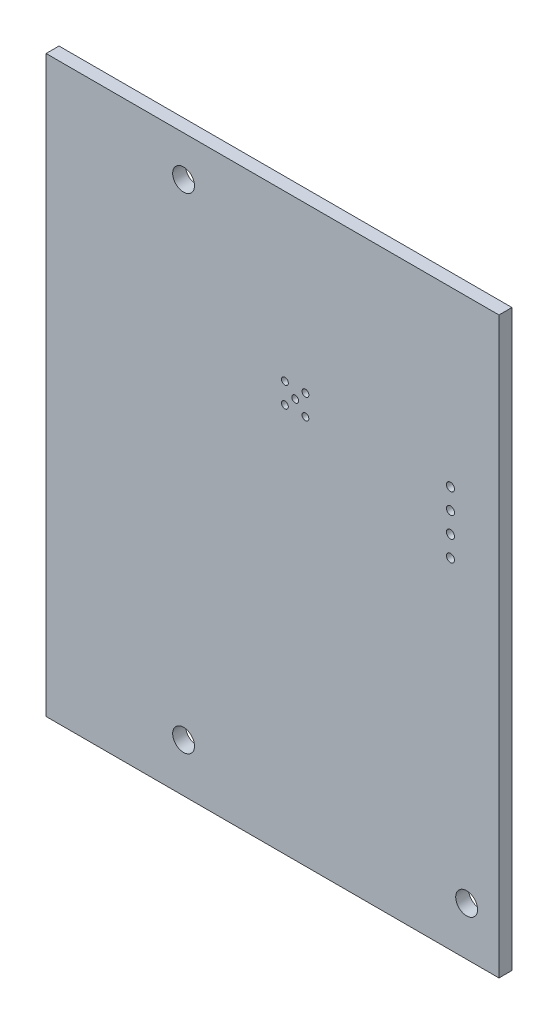
ISO-10303-21;
HEADER;
FILE_DESCRIPTION(('STEP AP214'),'2;1');
FILE_NAME('part.step','',(''),(''),'','','');
FILE_SCHEMA(('AUTOMOTIVE_DESIGN { 1 0 10303 214 1 1 1 1 }'));
ENDSEC;
DATA;
#1=APPLICATION_CONTEXT('core data for automotive mechanical design processes');
#2=APPLICATION_PROTOCOL_DEFINITION('international standard','automotive_design',2000,#1);
#3=PRODUCT_CONTEXT('',#1,'mechanical');
#4=PRODUCT('Part','Part','',(#3));
#5=PRODUCT_RELATED_PRODUCT_CATEGORY('part','',(#4));
#6=PRODUCT_DEFINITION_FORMATION('','',#4);
#7=PRODUCT_DEFINITION_CONTEXT('part definition',#1,'design');
#8=PRODUCT_DEFINITION('design','',#6,#7);
#9=PRODUCT_DEFINITION_SHAPE('','',#8);
#10=(LENGTH_UNIT() NAMED_UNIT(*) SI_UNIT(.MILLI.,.METRE.));
#11=(NAMED_UNIT(*) PLANE_ANGLE_UNIT() SI_UNIT($,.RADIAN.));
#12=(NAMED_UNIT(*) SI_UNIT($,.STERADIAN.) SOLID_ANGLE_UNIT());
#13=UNCERTAINTY_MEASURE_WITH_UNIT(LENGTH_MEASURE(1.E-05),#10,'distance_accuracy_value','');
#14=(GEOMETRIC_REPRESENTATION_CONTEXT(3) GLOBAL_UNCERTAINTY_ASSIGNED_CONTEXT((#13)) GLOBAL_UNIT_ASSIGNED_CONTEXT((#10,
#11,#12)) REPRESENTATION_CONTEXT('',''));
#15=CARTESIAN_POINT('',(0.,0.,0.));
#16=DIRECTION('',(0.,0.,1.));
#17=DIRECTION('',(1.,0.,0.));
#18=AXIS2_PLACEMENT_3D('',#15,#16,#17);
#19=CARTESIAN_POINT('',(105.,-65.,-0.8));
#20=DIRECTION('',(0.,0.,1.));
#21=DIRECTION('',(1.,0.,0.));
#22=AXIS2_PLACEMENT_3D('',#19,#20,#21);
#23=CYLINDRICAL_SURFACE('',#22,1.35);
#24=DIRECTION('',(0.,0.,1.));
#25=VECTOR('',#24,1.);
#26=CARTESIAN_POINT('',(106.35,-65.,-0.8));
#27=LINE('',#26,#25);
#28=CARTESIAN_POINT('',(106.35,-65.,0.));
#29=VERTEX_POINT('',#28);
#30=CARTESIAN_POINT('',(106.35,-65.,1.6));
#31=VERTEX_POINT('',#30);
#32=EDGE_CURVE('E11',#29,#31,#27,.T.);
#33=ORIENTED_EDGE('',*,*,#32,.F.);
#34=CARTESIAN_POINT('',(105.,-65.,0.));
#35=DIRECTION('',(0.,0.,1.));
#36=DIRECTION('',(1.,0.,0.));
#37=AXIS2_PLACEMENT_3D('',#34,#35,#36);
#38=CIRCLE('',#37,1.35);
#39=EDGE_CURVE('E173',#29,#29,#38,.T.);
#40=ORIENTED_EDGE('',*,*,#39,.F.);
#41=ORIENTED_EDGE('',*,*,#32,.T.);
#42=CARTESIAN_POINT('',(105.,-65.,1.6));
#43=DIRECTION('',(0.,0.,1.));
#44=DIRECTION('',(1.,0.,0.));
#45=AXIS2_PLACEMENT_3D('',#42,#43,#44);
#46=CIRCLE('',#45,1.35);
#47=EDGE_CURVE('E263',#31,#31,#46,.T.);
#48=ORIENTED_EDGE('',*,*,#47,.T.);
#49=EDGE_LOOP('',(#33,#40,#41,#48));
#50=FACE_BOUND('',#49,.T.);
#51=ADVANCED_FACE('F16',(#50),#23,.F.);
#52=CARTESIAN_POINT('',(117.53,-80.33,-0.8));
#53=DIRECTION('',(0.,0.,1.));
#54=DIRECTION('',(1.,0.,0.));
#55=AXIS2_PLACEMENT_3D('',#52,#53,#54);
#56=CYLINDRICAL_SURFACE('',#55,0.42);
#57=DIRECTION('',(0.,0.,1.));
#58=VECTOR('',#57,1.);
#59=CARTESIAN_POINT('',(117.95,-80.33,-0.8));
#60=LINE('',#59,#58);
#61=CARTESIAN_POINT('',(117.95,-80.33,0.));
#62=VERTEX_POINT('',#61);
#63=CARTESIAN_POINT('',(117.95,-80.33,1.6));
#64=VERTEX_POINT('',#63);
#65=EDGE_CURVE('E27',#62,#64,#60,.T.);
#66=ORIENTED_EDGE('',*,*,#65,.F.);
#67=CARTESIAN_POINT('',(117.53,-80.33,0.));
#68=DIRECTION('',(0.,0.,1.));
#69=DIRECTION('',(1.,0.,0.));
#70=AXIS2_PLACEMENT_3D('',#67,#68,#69);
#71=CIRCLE('',#70,0.42);
#72=EDGE_CURVE('E163',#62,#62,#71,.T.);
#73=ORIENTED_EDGE('',*,*,#72,.F.);
#74=ORIENTED_EDGE('',*,*,#65,.T.);
#75=CARTESIAN_POINT('',(117.53,-80.33,1.6));
#76=DIRECTION('',(0.,0.,1.));
#77=DIRECTION('',(1.,0.,0.));
#78=AXIS2_PLACEMENT_3D('',#75,#76,#77);
#79=CIRCLE('',#78,0.42);
#80=EDGE_CURVE('E165',#64,#64,#79,.T.);
#81=ORIENTED_EDGE('',*,*,#80,.T.);
#82=EDGE_LOOP('',(#66,#73,#74,#81));
#83=FACE_BOUND('',#82,.T.);
#84=ADVANCED_FACE('F162',(#83),#56,.F.);
#85=CARTESIAN_POINT('',(117.53,-82.87,-0.8));
#86=DIRECTION('',(0.,0.,1.));
#87=DIRECTION('',(1.,0.,0.));
#88=AXIS2_PLACEMENT_3D('',#85,#86,#87);
#89=CYLINDRICAL_SURFACE('',#88,0.42);
#90=DIRECTION('',(0.,0.,1.));
#91=VECTOR('',#90,1.);
#92=CARTESIAN_POINT('',(117.95,-82.87,-0.8));
#93=LINE('',#92,#91);
#94=CARTESIAN_POINT('',(117.95,-82.87,0.));
#95=VERTEX_POINT('',#94);
#96=CARTESIAN_POINT('',(117.95,-82.87,1.6));
#97=VERTEX_POINT('',#96);
#98=EDGE_CURVE('E167',#95,#97,#93,.T.);
#99=ORIENTED_EDGE('',*,*,#98,.F.);
#100=CARTESIAN_POINT('',(117.53,-82.87,0.));
#101=DIRECTION('',(0.,0.,1.));
#102=DIRECTION('',(1.,0.,0.));
#103=AXIS2_PLACEMENT_3D('',#100,#101,#102);
#104=CIRCLE('',#103,0.42);
#105=EDGE_CURVE('E174',#95,#95,#104,.T.);
#106=ORIENTED_EDGE('',*,*,#105,.F.);
#107=ORIENTED_EDGE('',*,*,#98,.T.);
#108=CARTESIAN_POINT('',(117.53,-82.87,1.6));
#109=DIRECTION('',(0.,0.,1.));
#110=DIRECTION('',(1.,0.,0.));
#111=AXIS2_PLACEMENT_3D('',#108,#109,#110);
#112=CIRCLE('',#111,0.42);
#113=EDGE_CURVE('E208',#97,#97,#112,.T.);
#114=ORIENTED_EDGE('',*,*,#113,.T.);
#115=EDGE_LOOP('',(#99,#106,#107,#114));
#116=FACE_BOUND('',#115,.T.);
#117=ADVANCED_FACE('F398',(#116),#89,.F.);
#118=CARTESIAN_POINT('',(120.07,-80.33,-0.8));
#119=DIRECTION('',(0.,0.,1.));
#120=DIRECTION('',(1.,0.,0.));
#121=AXIS2_PLACEMENT_3D('',#118,#119,#120);
#122=CYLINDRICAL_SURFACE('',#121,0.42);
#123=DIRECTION('',(0.,0.,1.));
#124=VECTOR('',#123,1.);
#125=CARTESIAN_POINT('',(120.49,-80.33,-0.8));
#126=LINE('',#125,#124);
#127=CARTESIAN_POINT('',(120.49,-80.33,0.));
#128=VERTEX_POINT('',#127);
#129=CARTESIAN_POINT('',(120.49,-80.33,1.6));
#130=VERTEX_POINT('',#129);
#131=EDGE_CURVE('E264',#128,#130,#126,.T.);
#132=ORIENTED_EDGE('',*,*,#131,.F.);
#133=CARTESIAN_POINT('',(120.07,-80.33,0.));
#134=DIRECTION('',(0.,0.,1.));
#135=DIRECTION('',(1.,0.,0.));
#136=AXIS2_PLACEMENT_3D('',#133,#134,#135);
#137=CIRCLE('',#136,0.42);
#138=EDGE_CURVE('E185',#128,#128,#137,.T.);
#139=ORIENTED_EDGE('',*,*,#138,.F.);
#140=ORIENTED_EDGE('',*,*,#131,.T.);
#141=CARTESIAN_POINT('',(120.07,-80.33,1.6));
#142=DIRECTION('',(0.,0.,1.));
#143=DIRECTION('',(1.,0.,0.));
#144=AXIS2_PLACEMENT_3D('',#141,#142,#143);
#145=CIRCLE('',#144,0.42);
#146=EDGE_CURVE('E212',#130,#130,#145,.T.);
#147=ORIENTED_EDGE('',*,*,#146,.T.);
#148=EDGE_LOOP('',(#132,#139,#140,#147));
#149=FACE_BOUND('',#148,.T.);
#150=ADVANCED_FACE('F433',(#149),#122,.F.);
#151=CARTESIAN_POINT('',(118.8,-81.6,-0.8));
#152=DIRECTION('',(0.,0.,1.));
#153=DIRECTION('',(1.,0.,0.));
#154=AXIS2_PLACEMENT_3D('',#151,#152,#153);
#155=CYLINDRICAL_SURFACE('',#154,0.42);
#156=DIRECTION('',(0.,0.,1.));
#157=VECTOR('',#156,1.);
#158=CARTESIAN_POINT('',(119.22,-81.6,-0.8));
#159=LINE('',#158,#157);
#160=CARTESIAN_POINT('',(119.22,-81.6,0.));
#161=VERTEX_POINT('',#160);
#162=CARTESIAN_POINT('',(119.22,-81.6,1.6));
#163=VERTEX_POINT('',#162);
#164=EDGE_CURVE('E267',#161,#163,#159,.T.);
#165=ORIENTED_EDGE('',*,*,#164,.F.);
#166=CARTESIAN_POINT('',(118.8,-81.6,0.));
#167=DIRECTION('',(0.,0.,1.));
#168=DIRECTION('',(1.,0.,0.));
#169=AXIS2_PLACEMENT_3D('',#166,#167,#168);
#170=CIRCLE('',#169,0.42);
#171=EDGE_CURVE('E252',#161,#161,#170,.T.);
#172=ORIENTED_EDGE('',*,*,#171,.F.);
#173=ORIENTED_EDGE('',*,*,#164,.T.);
#174=CARTESIAN_POINT('',(118.8,-81.6,1.6));
#175=DIRECTION('',(0.,0.,1.));
#176=DIRECTION('',(1.,0.,0.));
#177=AXIS2_PLACEMENT_3D('',#174,#175,#176);
#178=CIRCLE('',#177,0.42);
#179=EDGE_CURVE('E218',#163,#163,#178,.T.);
#180=ORIENTED_EDGE('',*,*,#179,.T.);
#181=EDGE_LOOP('',(#165,#172,#173,#180));
#182=FACE_BOUND('',#181,.T.);
#183=ADVANCED_FACE('F342',(#182),#155,.F.);
#184=CARTESIAN_POINT('',(120.07,-82.87,-0.8));
#185=DIRECTION('',(0.,0.,1.));
#186=DIRECTION('',(1.,0.,0.));
#187=AXIS2_PLACEMENT_3D('',#184,#185,#186);
#188=CYLINDRICAL_SURFACE('',#187,0.42);
#189=DIRECTION('',(0.,0.,1.));
#190=VECTOR('',#189,1.);
#191=CARTESIAN_POINT('',(120.49,-82.87,-0.8));
#192=LINE('',#191,#190);
#193=CARTESIAN_POINT('',(120.49,-82.87,0.));
#194=VERTEX_POINT('',#193);
#195=CARTESIAN_POINT('',(120.49,-82.87,1.6));
#196=VERTEX_POINT('',#195);
#197=EDGE_CURVE('E215',#194,#196,#192,.T.);
#198=ORIENTED_EDGE('',*,*,#197,.F.);
#199=CARTESIAN_POINT('',(120.07,-82.87,0.));
#200=DIRECTION('',(0.,0.,1.));
#201=DIRECTION('',(1.,0.,0.));
#202=AXIS2_PLACEMENT_3D('',#199,#200,#201);
#203=CIRCLE('',#202,0.42);
#204=EDGE_CURVE('E189',#194,#194,#203,.T.);
#205=ORIENTED_EDGE('',*,*,#204,.F.);
#206=ORIENTED_EDGE('',*,*,#197,.T.);
#207=CARTESIAN_POINT('',(120.07,-82.87,1.6));
#208=DIRECTION('',(0.,0.,1.));
#209=DIRECTION('',(1.,0.,0.));
#210=AXIS2_PLACEMENT_3D('',#207,#208,#209);
#211=CIRCLE('',#210,0.42);
#212=EDGE_CURVE('E222',#196,#196,#211,.T.);
#213=ORIENTED_EDGE('',*,*,#212,.T.);
#214=EDGE_LOOP('',(#198,#205,#206,#213));
#215=FACE_BOUND('',#214,.T.);
#216=ADVANCED_FACE('F406',(#215),#188,.F.);
#217=CARTESIAN_POINT('',(138.,-81.4,-0.8));
#218=DIRECTION('',(0.,0.,1.));
#219=DIRECTION('',(1.,0.,0.));
#220=AXIS2_PLACEMENT_3D('',#217,#218,#219);
#221=CYLINDRICAL_SURFACE('',#220,0.5);
#222=DIRECTION('',(0.,0.,1.));
#223=VECTOR('',#222,1.);
#224=CARTESIAN_POINT('',(138.5,-81.4,-0.8));
#225=LINE('',#224,#223);
#226=CARTESIAN_POINT('',(138.5,-81.4,0.));
#227=VERTEX_POINT('',#226);
#228=CARTESIAN_POINT('',(138.5,-81.4,1.6));
#229=VERTEX_POINT('',#228);
#230=EDGE_CURVE('E213',#227,#229,#225,.T.);
#231=ORIENTED_EDGE('',*,*,#230,.F.);
#232=CARTESIAN_POINT('',(138.,-81.4,0.));
#233=DIRECTION('',(0.,0.,1.));
#234=DIRECTION('',(1.,0.,0.));
#235=AXIS2_PLACEMENT_3D('',#232,#233,#234);
#236=CIRCLE('',#235,0.5);
#237=EDGE_CURVE('E308',#227,#227,#236,.T.);
#238=ORIENTED_EDGE('',*,*,#237,.F.);
#239=ORIENTED_EDGE('',*,*,#230,.T.);
#240=CARTESIAN_POINT('',(138.,-81.4,1.6));
#241=DIRECTION('',(0.,0.,1.));
#242=DIRECTION('',(1.,0.,0.));
#243=AXIS2_PLACEMENT_3D('',#240,#241,#242);
#244=CIRCLE('',#243,0.5);
#245=EDGE_CURVE('E256',#229,#229,#244,.T.);
#246=ORIENTED_EDGE('',*,*,#245,.T.);
#247=EDGE_LOOP('',(#231,#238,#239,#246));
#248=FACE_BOUND('',#247,.T.);
#249=ADVANCED_FACE('F402',(#248),#221,.F.);
#250=CARTESIAN_POINT('',(138.,-83.94,-0.8));
#251=DIRECTION('',(0.,0.,1.));
#252=DIRECTION('',(1.,0.,0.));
#253=AXIS2_PLACEMENT_3D('',#250,#251,#252);
#254=CYLINDRICAL_SURFACE('',#253,0.5);
#255=DIRECTION('',(0.,0.,1.));
#256=VECTOR('',#255,1.);
#257=CARTESIAN_POINT('',(138.5,-83.94,-0.8));
#258=LINE('',#257,#256);
#259=CARTESIAN_POINT('',(138.5,-83.94,0.));
#260=VERTEX_POINT('',#259);
#261=CARTESIAN_POINT('',(138.5,-83.94,1.6));
#262=VERTEX_POINT('',#261);
#263=EDGE_CURVE('E216',#260,#262,#258,.T.);
#264=ORIENTED_EDGE('',*,*,#263,.F.);
#265=CARTESIAN_POINT('',(138.,-83.94,0.));
#266=DIRECTION('',(0.,0.,1.));
#267=DIRECTION('',(1.,0.,0.));
#268=AXIS2_PLACEMENT_3D('',#265,#266,#267);
#269=CIRCLE('',#268,0.5);
#270=EDGE_CURVE('E194',#260,#260,#269,.T.);
#271=ORIENTED_EDGE('',*,*,#270,.F.);
#272=ORIENTED_EDGE('',*,*,#263,.T.);
#273=CARTESIAN_POINT('',(138.,-83.94,1.6));
#274=DIRECTION('',(0.,0.,1.));
#275=DIRECTION('',(1.,0.,0.));
#276=AXIS2_PLACEMENT_3D('',#273,#274,#275);
#277=CIRCLE('',#276,0.5);
#278=EDGE_CURVE('E260',#262,#262,#277,.T.);
#279=ORIENTED_EDGE('',*,*,#278,.T.);
#280=EDGE_LOOP('',(#264,#271,#272,#279));
#281=FACE_BOUND('',#280,.T.);
#282=ADVANCED_FACE('F405',(#281),#254,.F.);
#283=CARTESIAN_POINT('',(138.,-86.48,-0.8));
#284=DIRECTION('',(0.,0.,1.));
#285=DIRECTION('',(1.,0.,0.));
#286=AXIS2_PLACEMENT_3D('',#283,#284,#285);
#287=CYLINDRICAL_SURFACE('',#286,0.5);
#288=DIRECTION('',(0.,0.,1.));
#289=VECTOR('',#288,1.);
#290=CARTESIAN_POINT('',(138.5,-86.48,-0.8));
#291=LINE('',#290,#289);
#292=CARTESIAN_POINT('',(138.5,-86.48,0.));
#293=VERTEX_POINT('',#292);
#294=CARTESIAN_POINT('',(138.5,-86.48,1.6));
#295=VERTEX_POINT('',#294);
#296=EDGE_CURVE('E283',#293,#295,#291,.T.);
#297=ORIENTED_EDGE('',*,*,#296,.F.);
#298=CARTESIAN_POINT('',(138.,-86.48,0.));
#299=DIRECTION('',(0.,0.,1.));
#300=DIRECTION('',(1.,0.,0.));
#301=AXIS2_PLACEMENT_3D('',#298,#299,#300);
#302=CIRCLE('',#301,0.5);
#303=EDGE_CURVE('E191',#293,#293,#302,.T.);
#304=ORIENTED_EDGE('',*,*,#303,.F.);
#305=ORIENTED_EDGE('',*,*,#296,.T.);
#306=CARTESIAN_POINT('',(138.,-86.48,1.6));
#307=DIRECTION('',(0.,0.,1.));
#308=DIRECTION('',(1.,0.,0.));
#309=AXIS2_PLACEMENT_3D('',#306,#307,#308);
#310=CIRCLE('',#309,0.5);
#311=EDGE_CURVE('E206',#295,#295,#310,.T.);
#312=ORIENTED_EDGE('',*,*,#311,.T.);
#313=EDGE_LOOP('',(#297,#304,#305,#312));
#314=FACE_BOUND('',#313,.T.);
#315=ADVANCED_FACE('F410',(#314),#287,.F.);
#316=CARTESIAN_POINT('',(138.,-89.02,-0.8));
#317=DIRECTION('',(0.,0.,1.));
#318=DIRECTION('',(1.,0.,0.));
#319=AXIS2_PLACEMENT_3D('',#316,#317,#318);
#320=CYLINDRICAL_SURFACE('',#319,0.5);
#321=DIRECTION('',(0.,0.,1.));
#322=VECTOR('',#321,1.);
#323=CARTESIAN_POINT('',(138.5,-89.02,-0.8));
#324=LINE('',#323,#322);
#325=CARTESIAN_POINT('',(138.5,-89.02,0.));
#326=VERTEX_POINT('',#325);
#327=CARTESIAN_POINT('',(138.5,-89.02,1.6));
#328=VERTEX_POINT('',#327);
#329=EDGE_CURVE('E232',#326,#328,#324,.T.);
#330=ORIENTED_EDGE('',*,*,#329,.F.);
#331=CARTESIAN_POINT('',(138.,-89.02,0.));
#332=DIRECTION('',(0.,0.,1.));
#333=DIRECTION('',(1.,0.,0.));
#334=AXIS2_PLACEMENT_3D('',#331,#332,#333);
#335=CIRCLE('',#334,0.5);
#336=EDGE_CURVE('E195',#326,#326,#335,.T.);
#337=ORIENTED_EDGE('',*,*,#336,.F.);
#338=ORIENTED_EDGE('',*,*,#329,.T.);
#339=CARTESIAN_POINT('',(138.,-89.02,1.6));
#340=DIRECTION('',(0.,0.,1.));
#341=DIRECTION('',(1.,0.,0.));
#342=AXIS2_PLACEMENT_3D('',#339,#340,#341);
#343=CIRCLE('',#342,0.5);
#344=EDGE_CURVE('E202',#328,#328,#343,.T.);
#345=ORIENTED_EDGE('',*,*,#344,.T.);
#346=EDGE_LOOP('',(#330,#337,#338,#345));
#347=FACE_BOUND('',#346,.T.);
#348=ADVANCED_FACE('F415',(#347),#320,.F.);
#349=CARTESIAN_POINT('',(105.,-125.,-0.8));
#350=DIRECTION('',(0.,0.,1.));
#351=DIRECTION('',(1.,0.,0.));
#352=AXIS2_PLACEMENT_3D('',#349,#350,#351);
#353=CYLINDRICAL_SURFACE('',#352,1.35);
#354=DIRECTION('',(0.,0.,1.));
#355=VECTOR('',#354,1.);
#356=CARTESIAN_POINT('',(106.35,-125.,-0.8));
#357=LINE('',#356,#355);
#358=CARTESIAN_POINT('',(106.35,-125.,0.));
#359=VERTEX_POINT('',#358);
#360=CARTESIAN_POINT('',(106.35,-125.,1.6));
#361=VERTEX_POINT('',#360);
#362=EDGE_CURVE('E229',#359,#361,#357,.T.);
#363=ORIENTED_EDGE('',*,*,#362,.F.);
#364=CARTESIAN_POINT('',(105.,-125.,0.));
#365=DIRECTION('',(0.,0.,1.));
#366=DIRECTION('',(1.,0.,0.));
#367=AXIS2_PLACEMENT_3D('',#364,#365,#366);
#368=CIRCLE('',#367,1.35);
#369=EDGE_CURVE('E227',#359,#359,#368,.T.);
#370=ORIENTED_EDGE('',*,*,#369,.F.);
#371=ORIENTED_EDGE('',*,*,#362,.T.);
#372=CARTESIAN_POINT('',(105.,-125.,1.6));
#373=DIRECTION('',(0.,0.,1.));
#374=DIRECTION('',(1.,0.,0.));
#375=AXIS2_PLACEMENT_3D('',#372,#373,#374);
#376=CIRCLE('',#375,1.35);
#377=EDGE_CURVE('E207',#361,#361,#376,.T.);
#378=ORIENTED_EDGE('',*,*,#377,.T.);
#379=EDGE_LOOP('',(#363,#370,#371,#378));
#380=FACE_BOUND('',#379,.T.);
#381=ADVANCED_FACE('F413',(#380),#353,.F.);
#382=CARTESIAN_POINT('',(140.,-125.,-0.8));
#383=DIRECTION('',(0.,0.,1.));
#384=DIRECTION('',(1.,0.,0.));
#385=AXIS2_PLACEMENT_3D('',#382,#383,#384);
#386=CYLINDRICAL_SURFACE('',#385,1.35);
#387=DIRECTION('',(0.,0.,1.));
#388=VECTOR('',#387,1.);
#389=CARTESIAN_POINT('',(141.35,-125.,-0.8));
#390=LINE('',#389,#388);
#391=CARTESIAN_POINT('',(141.35,-125.,0.));
#392=VERTEX_POINT('',#391);
#393=CARTESIAN_POINT('',(141.35,-125.,1.6));
#394=VERTEX_POINT('',#393);
#395=EDGE_CURVE('E233',#392,#394,#390,.T.);
#396=ORIENTED_EDGE('',*,*,#395,.F.);
#397=CARTESIAN_POINT('',(140.,-125.,0.));
#398=DIRECTION('',(0.,0.,1.));
#399=DIRECTION('',(1.,0.,0.));
#400=AXIS2_PLACEMENT_3D('',#397,#398,#399);
#401=CIRCLE('',#400,1.35);
#402=EDGE_CURVE('E223',#392,#392,#401,.T.);
#403=ORIENTED_EDGE('',*,*,#402,.F.);
#404=ORIENTED_EDGE('',*,*,#395,.T.);
#405=CARTESIAN_POINT('',(140.,-125.,1.6));
#406=DIRECTION('',(0.,0.,1.));
#407=DIRECTION('',(1.,0.,0.));
#408=AXIS2_PLACEMENT_3D('',#405,#406,#407);
#409=CIRCLE('',#408,1.35);
#410=EDGE_CURVE('E245',#394,#394,#409,.T.);
#411=ORIENTED_EDGE('',*,*,#410,.T.);
#412=EDGE_LOOP('',(#396,#403,#404,#411));
#413=FACE_BOUND('',#412,.T.);
#414=ADVANCED_FACE('F18',(#413),#386,.F.);
#415=CARTESIAN_POINT('',(144.,-60.,0.));
#416=DIRECTION('',(1.,0.,0.));
#417=DIRECTION('',(0.,1.,0.));
#418=AXIS2_PLACEMENT_3D('',#415,#416,#417);
#419=PLANE('',#418);
#420=DIRECTION('',(0.,0.,1.));
#421=VECTOR('',#420,1.);
#422=CARTESIAN_POINT('',(144.,-60.,0.));
#423=LINE('',#422,#421);
#424=CARTESIAN_POINT('',(144.,-60.,0.));
#425=VERTEX_POINT('',#424);
#426=CARTESIAN_POINT('',(144.,-60.,1.6));
#427=VERTEX_POINT('',#426);
#428=EDGE_CURVE('E275',#425,#427,#423,.T.);
#429=ORIENTED_EDGE('',*,*,#428,.T.);
#430=DIRECTION('',(0.,-1.,0.));
#431=VECTOR('',#430,1.);
#432=CARTESIAN_POINT('',(144.,-60.,1.6));
#433=LINE('',#432,#431);
#434=CARTESIAN_POINT('',(144.,-131.,1.6));
#435=VERTEX_POINT('',#434);
#436=EDGE_CURVE('E181',#427,#435,#433,.T.);
#437=ORIENTED_EDGE('',*,*,#436,.T.);
#438=DIRECTION('',(0.,0.,1.));
#439=VECTOR('',#438,1.);
#440=CARTESIAN_POINT('',(144.,-131.,0.));
#441=LINE('',#440,#439);
#442=CARTESIAN_POINT('',(144.,-131.,0.));
#443=VERTEX_POINT('',#442);
#444=EDGE_CURVE('E248',#443,#435,#441,.T.);
#445=ORIENTED_EDGE('',*,*,#444,.F.);
#446=DIRECTION('',(0.,-1.,0.));
#447=VECTOR('',#446,1.);
#448=CARTESIAN_POINT('',(144.,-60.,0.));
#449=LINE('',#448,#447);
#450=EDGE_CURVE('E228',#425,#443,#449,.T.);
#451=ORIENTED_EDGE('',*,*,#450,.F.);
#452=EDGE_LOOP('',(#429,#437,#445,#451));
#453=FACE_BOUND('',#452,.T.);
#454=ADVANCED_FACE('F375',(#453),#419,.T.);
#455=CARTESIAN_POINT('',(116.,-95.5,1.6));
#456=DIRECTION('',(0.,0.,-1.));
#457=DIRECTION('',(0.,-1.,0.));
#458=AXIS2_PLACEMENT_3D('',#455,#456,#457);
#459=PLANE('',#458);
#460=ORIENTED_EDGE('',*,*,#47,.F.);
#461=EDGE_LOOP('',(#460));
#462=FACE_BOUND('',#461,.T.);
#463=ORIENTED_EDGE('',*,*,#80,.F.);
#464=EDGE_LOOP('',(#463));
#465=FACE_BOUND('',#464,.T.);
#466=ORIENTED_EDGE('',*,*,#113,.F.);
#467=EDGE_LOOP('',(#466));
#468=FACE_BOUND('',#467,.T.);
#469=ORIENTED_EDGE('',*,*,#146,.F.);
#470=EDGE_LOOP('',(#469));
#471=FACE_BOUND('',#470,.T.);
#472=ORIENTED_EDGE('',*,*,#179,.F.);
#473=EDGE_LOOP('',(#472));
#474=FACE_BOUND('',#473,.T.);
#475=ORIENTED_EDGE('',*,*,#212,.F.);
#476=EDGE_LOOP('',(#475));
#477=FACE_BOUND('',#476,.T.);
#478=ORIENTED_EDGE('',*,*,#245,.F.);
#479=EDGE_LOOP('',(#478));
#480=FACE_BOUND('',#479,.T.);
#481=ORIENTED_EDGE('',*,*,#278,.F.);
#482=EDGE_LOOP('',(#481));
#483=FACE_BOUND('',#482,.T.);
#484=ORIENTED_EDGE('',*,*,#311,.F.);
#485=EDGE_LOOP('',(#484));
#486=FACE_BOUND('',#485,.T.);
#487=ORIENTED_EDGE('',*,*,#344,.F.);
#488=EDGE_LOOP('',(#487));
#489=FACE_BOUND('',#488,.T.);
#490=ORIENTED_EDGE('',*,*,#377,.F.);
#491=EDGE_LOOP('',(#490));
#492=FACE_BOUND('',#491,.T.);
#493=ORIENTED_EDGE('',*,*,#410,.F.);
#494=EDGE_LOOP('',(#493));
#495=FACE_BOUND('',#494,.T.);
#496=DIRECTION('',(-1.,0.,0.));
#497=VECTOR('',#496,1.);
#498=CARTESIAN_POINT('',(144.,-131.,1.6));
#499=LINE('',#498,#497);
#500=CARTESIAN_POINT('',(88.,-131.,1.6));
#501=VERTEX_POINT('',#500);
#502=EDGE_CURVE('E240',#435,#501,#499,.T.);
#503=ORIENTED_EDGE('',*,*,#502,.F.);
#504=ORIENTED_EDGE('',*,*,#436,.F.);
#505=DIRECTION('',(1.,0.,0.));
#506=VECTOR('',#505,1.);
#507=CARTESIAN_POINT('',(88.,-60.,1.6));
#508=LINE('',#507,#506);
#509=CARTESIAN_POINT('',(88.,-60.,1.6));
#510=VERTEX_POINT('',#509);
#511=EDGE_CURVE('E239',#510,#427,#508,.T.);
#512=ORIENTED_EDGE('',*,*,#511,.F.);
#513=DIRECTION('',(0.,1.,0.));
#514=VECTOR('',#513,1.);
#515=CARTESIAN_POINT('',(88.,-131.,1.6));
#516=LINE('',#515,#514);
#517=EDGE_CURVE('E196',#501,#510,#516,.T.);
#518=ORIENTED_EDGE('',*,*,#517,.F.);
#519=EDGE_LOOP('',(#503,#504,#512,#518));
#520=FACE_BOUND('',#519,.T.);
#521=ADVANCED_FACE('F348',(#462,#465,#468,#471,#474,#477,#480,#483,#486,#489,#492,#495,#520),
#459,.F.);
#522=CARTESIAN_POINT('',(116.,-95.5,0.));
#523=DIRECTION('',(0.,0.,-1.));
#524=DIRECTION('',(0.,-1.,0.));
#525=AXIS2_PLACEMENT_3D('',#522,#523,#524);
#526=PLANE('',#525);
#527=ORIENTED_EDGE('',*,*,#39,.T.);
#528=EDGE_LOOP('',(#527));
#529=FACE_BOUND('',#528,.T.);
#530=ORIENTED_EDGE('',*,*,#72,.T.);
#531=EDGE_LOOP('',(#530));
#532=FACE_BOUND('',#531,.T.);
#533=ORIENTED_EDGE('',*,*,#105,.T.);
#534=EDGE_LOOP('',(#533));
#535=FACE_BOUND('',#534,.T.);
#536=ORIENTED_EDGE('',*,*,#138,.T.);
#537=EDGE_LOOP('',(#536));
#538=FACE_BOUND('',#537,.T.);
#539=ORIENTED_EDGE('',*,*,#171,.T.);
#540=EDGE_LOOP('',(#539));
#541=FACE_BOUND('',#540,.T.);
#542=ORIENTED_EDGE('',*,*,#204,.T.);
#543=EDGE_LOOP('',(#542));
#544=FACE_BOUND('',#543,.T.);
#545=ORIENTED_EDGE('',*,*,#237,.T.);
#546=EDGE_LOOP('',(#545));
#547=FACE_BOUND('',#546,.T.);
#548=ORIENTED_EDGE('',*,*,#270,.T.);
#549=EDGE_LOOP('',(#548));
#550=FACE_BOUND('',#549,.T.);
#551=ORIENTED_EDGE('',*,*,#303,.T.);
#552=EDGE_LOOP('',(#551));
#553=FACE_BOUND('',#552,.T.);
#554=ORIENTED_EDGE('',*,*,#336,.T.);
#555=EDGE_LOOP('',(#554));
#556=FACE_BOUND('',#555,.T.);
#557=ORIENTED_EDGE('',*,*,#369,.T.);
#558=EDGE_LOOP('',(#557));
#559=FACE_BOUND('',#558,.T.);
#560=ORIENTED_EDGE('',*,*,#402,.T.);
#561=EDGE_LOOP('',(#560));
#562=FACE_BOUND('',#561,.T.);
#563=DIRECTION('',(0.,1.,0.));
#564=VECTOR('',#563,1.);
#565=CARTESIAN_POINT('',(88.,-131.,0.));
#566=LINE('',#565,#564);
#567=CARTESIAN_POINT('',(88.,-131.,0.));
#568=VERTEX_POINT('',#567);
#569=CARTESIAN_POINT('',(88.,-60.,0.));
#570=VERTEX_POINT('',#569);
#571=EDGE_CURVE('E20',#568,#570,#566,.T.);
#572=ORIENTED_EDGE('',*,*,#571,.T.);
#573=DIRECTION('',(1.,0.,0.));
#574=VECTOR('',#573,1.);
#575=CARTESIAN_POINT('',(88.,-60.,0.));
#576=LINE('',#575,#574);
#577=EDGE_CURVE('E271',#570,#425,#576,.T.);
#578=ORIENTED_EDGE('',*,*,#577,.T.);
#579=ORIENTED_EDGE('',*,*,#450,.T.);
#580=DIRECTION('',(-1.,0.,0.));
#581=VECTOR('',#580,1.);
#582=CARTESIAN_POINT('',(144.,-131.,0.));
#583=LINE('',#582,#581);
#584=EDGE_CURVE('E237',#443,#568,#583,.T.);
#585=ORIENTED_EDGE('',*,*,#584,.T.);
#586=EDGE_LOOP('',(#572,#578,#579,#585));
#587=FACE_BOUND('',#586,.T.);
#588=ADVANCED_FACE('F170',(#529,#532,#535,#538,#541,#544,#547,#550,#553,#556,#559,#562,#587),
#526,.T.);
#589=CARTESIAN_POINT('',(88.,-60.,0.));
#590=DIRECTION('',(0.,1.,0.));
#591=DIRECTION('',(1.,0.,0.));
#592=AXIS2_PLACEMENT_3D('',#589,#590,#591);
#593=PLANE('',#592);
#594=DIRECTION('',(0.,0.,1.));
#595=VECTOR('',#594,1.);
#596=CARTESIAN_POINT('',(88.,-60.,0.));
#597=LINE('',#596,#595);
#598=EDGE_CURVE('E200',#570,#510,#597,.T.);
#599=ORIENTED_EDGE('',*,*,#598,.T.);
#600=ORIENTED_EDGE('',*,*,#511,.T.);
#601=ORIENTED_EDGE('',*,*,#428,.F.);
#602=ORIENTED_EDGE('',*,*,#577,.F.);
#603=EDGE_LOOP('',(#599,#600,#601,#602));
#604=FACE_BOUND('',#603,.T.);
#605=ADVANCED_FACE('F347',(#604),#593,.T.);
#606=CARTESIAN_POINT('',(144.,-131.,0.));
#607=DIRECTION('',(0.,-1.,0.));
#608=DIRECTION('',(0.,0.,-1.));
#609=AXIS2_PLACEMENT_3D('',#606,#607,#608);
#610=PLANE('',#609);
#611=ORIENTED_EDGE('',*,*,#444,.T.);
#612=ORIENTED_EDGE('',*,*,#502,.T.);
#613=DIRECTION('',(0.,0.,1.));
#614=VECTOR('',#613,1.);
#615=CARTESIAN_POINT('',(88.,-131.,0.));
#616=LINE('',#615,#614);
#617=EDGE_CURVE('E201',#568,#501,#616,.T.);
#618=ORIENTED_EDGE('',*,*,#617,.F.);
#619=ORIENTED_EDGE('',*,*,#584,.F.);
#620=EDGE_LOOP('',(#611,#612,#618,#619));
#621=FACE_BOUND('',#620,.T.);
#622=ADVANCED_FACE('F379',(#621),#610,.T.);
#623=CARTESIAN_POINT('',(88.,-131.,0.));
#624=DIRECTION('',(-1.,0.,0.));
#625=DIRECTION('',(0.,0.,1.));
#626=AXIS2_PLACEMENT_3D('',#623,#624,#625);
#627=PLANE('',#626);
#628=ORIENTED_EDGE('',*,*,#617,.T.);
#629=ORIENTED_EDGE('',*,*,#517,.T.);
#630=ORIENTED_EDGE('',*,*,#598,.F.);
#631=ORIENTED_EDGE('',*,*,#571,.F.);
#632=EDGE_LOOP('',(#628,#629,#630,#631));
#633=FACE_BOUND('',#632,.T.);
#634=ADVANCED_FACE('F371',(#633),#627,.T.);
#635=CLOSED_SHELL('',(#51,#84,#117,#150,#183,#216,#249,#282,#315,#348,#381,#414,#454,#521,#588,
#605,#622,#634));
#636=MANIFOLD_SOLID_BREP('B1',#635);
#637=ADVANCED_BREP_SHAPE_REPRESENTATION('',(#18,#636),#14);
#638=SHAPE_DEFINITION_REPRESENTATION(#9,#637);
ENDSEC;
END-ISO-10303-21;
